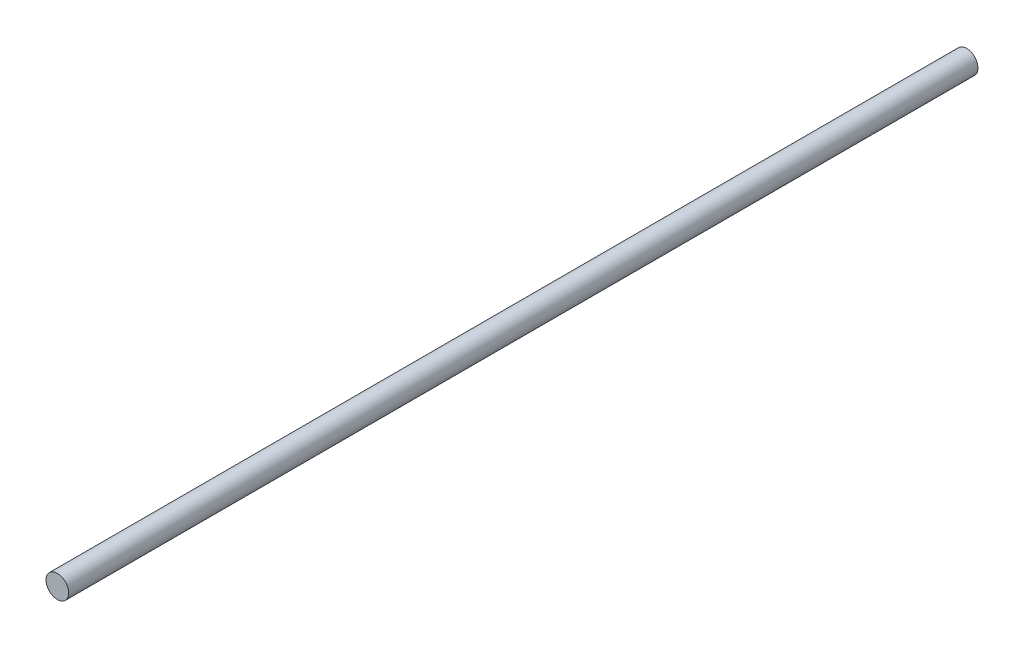
ISO-10303-21;
HEADER;
FILE_DESCRIPTION(('STEP AP214'),'2;1');
FILE_NAME('part.step','',(''),(''),'','','');
FILE_SCHEMA(('AUTOMOTIVE_DESIGN { 1 0 10303 214 1 1 1 1 }'));
ENDSEC;
DATA;
#1=APPLICATION_CONTEXT('core data for automotive mechanical design processes');
#2=APPLICATION_PROTOCOL_DEFINITION('international standard','automotive_design',2000,#1);
#3=PRODUCT_CONTEXT('',#1,'mechanical');
#4=PRODUCT('Part','Part','',(#3));
#5=PRODUCT_RELATED_PRODUCT_CATEGORY('part','',(#4));
#6=PRODUCT_DEFINITION_FORMATION('','',#4);
#7=PRODUCT_DEFINITION_CONTEXT('part definition',#1,'design');
#8=PRODUCT_DEFINITION('design','',#6,#7);
#9=PRODUCT_DEFINITION_SHAPE('','',#8);
#10=(LENGTH_UNIT() NAMED_UNIT(*) SI_UNIT(.MILLI.,.METRE.));
#11=(NAMED_UNIT(*) PLANE_ANGLE_UNIT() SI_UNIT($,.RADIAN.));
#12=(NAMED_UNIT(*) SI_UNIT($,.STERADIAN.) SOLID_ANGLE_UNIT());
#13=UNCERTAINTY_MEASURE_WITH_UNIT(LENGTH_MEASURE(1.E-05),#10,'distance_accuracy_value','');
#14=(GEOMETRIC_REPRESENTATION_CONTEXT(3) GLOBAL_UNCERTAINTY_ASSIGNED_CONTEXT((#13)) GLOBAL_UNIT_ASSIGNED_CONTEXT((#10,
#11,#12)) REPRESENTATION_CONTEXT('',''));
#15=CARTESIAN_POINT('',(0.,0.,0.));
#16=DIRECTION('',(0.,0.,1.));
#17=DIRECTION('',(1.,0.,0.));
#18=AXIS2_PLACEMENT_3D('',#15,#16,#17);
#19=CARTESIAN_POINT('',(0.,0.,400.));
#20=DIRECTION('',(0.,0.,-1.));
#21=DIRECTION('',(-1.,0.,0.));
#22=AXIS2_PLACEMENT_3D('',#19,#20,#21);
#23=CYLINDRICAL_SURFACE('',#22,5.);
#24=CARTESIAN_POINT('',(0.,0.,400.));
#25=DIRECTION('',(0.,0.,1.));
#26=DIRECTION('',(1.,0.,0.));
#27=AXIS2_PLACEMENT_3D('',#24,#25,#26);
#28=CIRCLE('',#27,5.);
#29=CARTESIAN_POINT('',(5.,0.,400.));
#30=VERTEX_POINT('',#29);
#31=EDGE_CURVE('E10',#30,#30,#28,.T.);
#32=ORIENTED_EDGE('',*,*,#31,.F.);
#33=EDGE_LOOP('',(#32));
#34=FACE_BOUND('',#33,.T.);
#35=CARTESIAN_POINT('',(0.,0.,0.));
#36=DIRECTION('',(0.,0.,1.));
#37=DIRECTION('',(1.,0.,0.));
#38=AXIS2_PLACEMENT_3D('',#35,#36,#37);
#39=CIRCLE('',#38,5.);
#40=CARTESIAN_POINT('',(5.,0.,0.));
#41=VERTEX_POINT('',#40);
#42=EDGE_CURVE('E34',#41,#41,#39,.T.);
#43=ORIENTED_EDGE('',*,*,#42,.T.);
#44=EDGE_LOOP('',(#43));
#45=FACE_BOUND('',#44,.T.);
#46=ADVANCED_FACE('F31',(#34,#45),#23,.T.);
#47=CARTESIAN_POINT('',(0.,0.,400.));
#48=DIRECTION('',(0.,0.,1.));
#49=DIRECTION('',(1.,0.,0.));
#50=AXIS2_PLACEMENT_3D('',#47,#48,#49);
#51=PLANE('',#50);
#52=ORIENTED_EDGE('',*,*,#31,.T.);
#53=EDGE_LOOP('',(#52));
#54=FACE_BOUND('',#53,.T.);
#55=ADVANCED_FACE('F46',(#54),#51,.T.);
#56=CARTESIAN_POINT('',(0.,0.,0.));
#57=DIRECTION('',(0.,0.,1.));
#58=DIRECTION('',(1.,0.,0.));
#59=AXIS2_PLACEMENT_3D('',#56,#57,#58);
#60=PLANE('',#59);
#61=ORIENTED_EDGE('',*,*,#42,.F.);
#62=EDGE_LOOP('',(#61));
#63=FACE_BOUND('',#62,.T.);
#64=ADVANCED_FACE('F44',(#63),#60,.F.);
#65=CLOSED_SHELL('',(#46,#55,#64));
#66=MANIFOLD_SOLID_BREP('B2',#65);
#67=ADVANCED_BREP_SHAPE_REPRESENTATION('',(#18,#66),#14);
#68=SHAPE_DEFINITION_REPRESENTATION(#9,#67);
ENDSEC;
END-ISO-10303-21;
